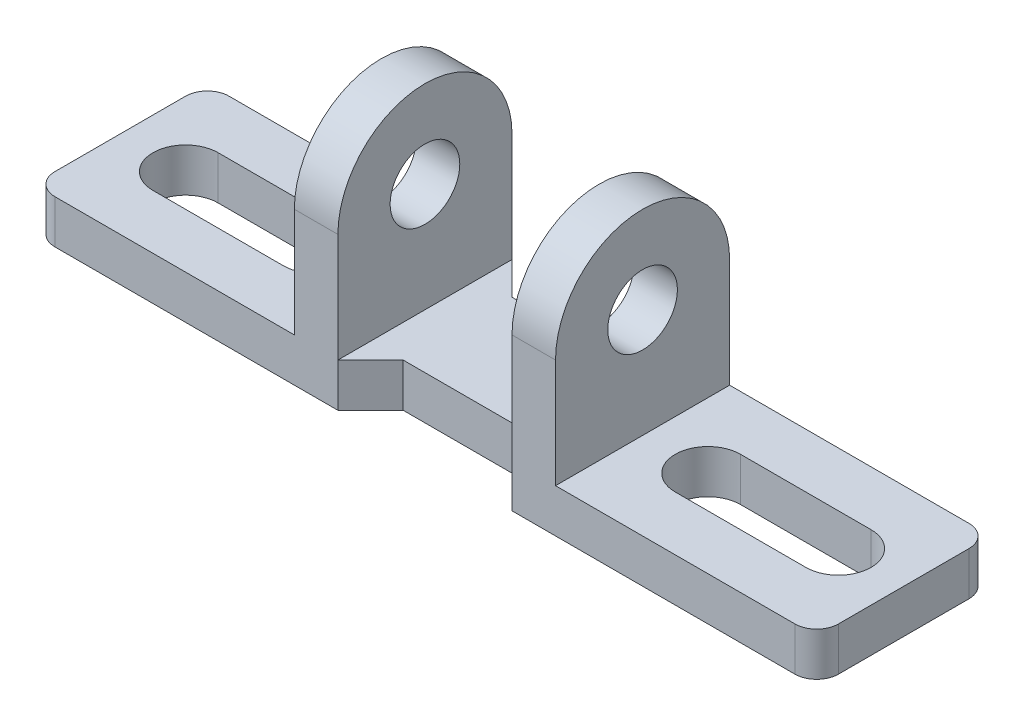
ISO-10303-21;
HEADER;
FILE_DESCRIPTION(('STEP AP214'),'2;1');
FILE_NAME('part.step','',(''),(''),'','','');
FILE_SCHEMA(('AUTOMOTIVE_DESIGN { 1 0 10303 214 1 1 1 1 }'));
ENDSEC;
DATA;
#1=APPLICATION_CONTEXT('core data for automotive mechanical design processes');
#2=APPLICATION_PROTOCOL_DEFINITION('international standard','automotive_design',2000,#1);
#3=PRODUCT_CONTEXT('',#1,'mechanical');
#4=PRODUCT('Part','Part','',(#3));
#5=PRODUCT_RELATED_PRODUCT_CATEGORY('part','',(#4));
#6=PRODUCT_DEFINITION_FORMATION('','',#4);
#7=PRODUCT_DEFINITION_CONTEXT('part definition',#1,'design');
#8=PRODUCT_DEFINITION('design','',#6,#7);
#9=PRODUCT_DEFINITION_SHAPE('','',#8);
#10=(LENGTH_UNIT() NAMED_UNIT(*) SI_UNIT(.MILLI.,.METRE.));
#11=(NAMED_UNIT(*) PLANE_ANGLE_UNIT() SI_UNIT($,.RADIAN.));
#12=(NAMED_UNIT(*) SI_UNIT($,.STERADIAN.) SOLID_ANGLE_UNIT());
#13=UNCERTAINTY_MEASURE_WITH_UNIT(LENGTH_MEASURE(1.E-05),#10,'distance_accuracy_value','');
#14=(GEOMETRIC_REPRESENTATION_CONTEXT(3) GLOBAL_UNCERTAINTY_ASSIGNED_CONTEXT((#13)) GLOBAL_UNIT_ASSIGNED_CONTEXT((#10,
#11,#12)) REPRESENTATION_CONTEXT('',''));
#15=CARTESIAN_POINT('',(0.,0.,0.));
#16=DIRECTION('',(0.,0.,1.));
#17=DIRECTION('',(1.,0.,0.));
#18=AXIS2_PLACEMENT_3D('',#15,#16,#17);
#19=CARTESIAN_POINT('',(-18.,2.,-4.));
#20=DIRECTION('',(0.,0.,1.));
#21=DIRECTION('',(1.,0.,0.));
#22=AXIS2_PLACEMENT_3D('',#19,#20,#21);
#23=PLANE('',#22);
#24=DIRECTION('',(-1.,0.,0.));
#25=VECTOR('',#24,1.);
#26=CARTESIAN_POINT('',(-18.,0.,-4.));
#27=LINE('',#26,#25);
#28=CARTESIAN_POINT('',(-4.,0.,-4.));
#29=VERTEX_POINT('',#28);
#30=CARTESIAN_POINT('',(-17.,0.,-4.));
#31=VERTEX_POINT('',#30);
#32=EDGE_CURVE('E384',#29,#31,#27,.T.);
#33=ORIENTED_EDGE('',*,*,#32,.T.);
#34=DIRECTION('',(0.,-1.,0.));
#35=VECTOR('',#34,1.);
#36=CARTESIAN_POINT('',(-17.,2.,-4.));
#37=LINE('',#36,#35);
#38=CARTESIAN_POINT('',(-17.,2.,-4.));
#39=VERTEX_POINT('',#38);
#40=EDGE_CURVE('E12',#31,#39,#37,.F.);
#41=ORIENTED_EDGE('',*,*,#40,.T.);
#42=DIRECTION('',(-1.,0.,0.));
#43=VECTOR('',#42,1.);
#44=CARTESIAN_POINT('',(-18.,2.,-4.));
#45=LINE('',#44,#43);
#46=CARTESIAN_POINT('',(-6.,2.,-4.));
#47=VERTEX_POINT('',#46);
#48=EDGE_CURVE('E372',#47,#39,#45,.T.);
#49=ORIENTED_EDGE('',*,*,#48,.F.);
#50=DIRECTION('',(0.,-1.,0.));
#51=VECTOR('',#50,1.);
#52=CARTESIAN_POINT('',(-6.,11.,-4.));
#53=LINE('',#52,#51);
#54=CARTESIAN_POINT('',(-6.,7.,-4.));
#55=VERTEX_POINT('',#54);
#56=EDGE_CURVE('E297',#55,#47,#53,.T.);
#57=ORIENTED_EDGE('',*,*,#56,.F.);
#58=DIRECTION('',(1.,0.,0.));
#59=VECTOR('',#58,1.);
#60=CARTESIAN_POINT('',(-18.,7.,-4.));
#61=LINE('',#60,#59);
#62=CARTESIAN_POINT('',(-4.,7.,-4.));
#63=VERTEX_POINT('',#62);
#64=EDGE_CURVE('E269',#55,#63,#61,.T.);
#65=ORIENTED_EDGE('',*,*,#64,.T.);
#66=DIRECTION('',(0.,-1.,0.));
#67=VECTOR('',#66,1.);
#68=CARTESIAN_POINT('',(-4.,11.,-4.));
#69=LINE('',#68,#67);
#70=CARTESIAN_POINT('',(-4.,2.,-4.));
#71=VERTEX_POINT('',#70);
#72=EDGE_CURVE('E299',#63,#71,#69,.T.);
#73=ORIENTED_EDGE('',*,*,#72,.T.);
#74=DIRECTION('',(0.,1.,0.));
#75=VECTOR('',#74,1.);
#76=CARTESIAN_POINT('',(-4.,0.,-4.));
#77=LINE('',#76,#75);
#78=EDGE_CURVE('E447',#29,#71,#77,.T.);
#79=ORIENTED_EDGE('',*,*,#78,.F.);
#80=EDGE_LOOP('',(#33,#41,#49,#57,#65,#73,#79));
#81=FACE_BOUND('',#80,.T.);
#82=ADVANCED_FACE('F60',(#81),#23,.F.);
#83=CARTESIAN_POINT('',(17.,2.,-4.));
#84=VERTEX_POINT('',#83);
#85=CARTESIAN_POINT('',(6.,2.,-4.));
#86=VERTEX_POINT('',#85);
#87=EDGE_CURVE('E374',#84,#86,#45,.T.);
#88=ORIENTED_EDGE('',*,*,#87,.F.);
#89=DIRECTION('',(0.,-1.,0.));
#90=VECTOR('',#89,1.);
#91=CARTESIAN_POINT('',(17.,2.,-4.));
#92=LINE('',#91,#90);
#93=CARTESIAN_POINT('',(17.,0.,-4.));
#94=VERTEX_POINT('',#93);
#95=EDGE_CURVE('E381',#84,#94,#92,.T.);
#96=ORIENTED_EDGE('',*,*,#95,.T.);
#97=CARTESIAN_POINT('',(4.,0.,-4.));
#98=VERTEX_POINT('',#97);
#99=EDGE_CURVE('E385',#94,#98,#27,.T.);
#100=ORIENTED_EDGE('',*,*,#99,.T.);
#101=DIRECTION('',(0.,1.,0.));
#102=VECTOR('',#101,1.);
#103=CARTESIAN_POINT('',(4.,0.,-4.));
#104=LINE('',#103,#102);
#105=CARTESIAN_POINT('',(4.,2.,-4.));
#106=VERTEX_POINT('',#105);
#107=EDGE_CURVE('E454',#98,#106,#104,.T.);
#108=ORIENTED_EDGE('',*,*,#107,.T.);
#109=DIRECTION('',(0.,-1.,0.));
#110=VECTOR('',#109,1.);
#111=CARTESIAN_POINT('',(4.,11.,-4.));
#112=LINE('',#111,#110);
#113=CARTESIAN_POINT('',(4.,7.,-4.));
#114=VERTEX_POINT('',#113);
#115=EDGE_CURVE('E278',#114,#106,#112,.T.);
#116=ORIENTED_EDGE('',*,*,#115,.F.);
#117=CARTESIAN_POINT('',(6.,7.,-4.));
#118=VERTEX_POINT('',#117);
#119=EDGE_CURVE('E262',#114,#118,#61,.T.);
#120=ORIENTED_EDGE('',*,*,#119,.T.);
#121=DIRECTION('',(0.,-1.,0.));
#122=VECTOR('',#121,1.);
#123=CARTESIAN_POINT('',(6.,11.,-4.));
#124=LINE('',#123,#122);
#125=EDGE_CURVE('E275',#118,#86,#124,.T.);
#126=ORIENTED_EDGE('',*,*,#125,.T.);
#127=EDGE_LOOP('',(#88,#96,#100,#108,#116,#120,#126));
#128=FACE_BOUND('',#127,.T.);
#129=ADVANCED_FACE('F274',(#128),#23,.F.);
#130=CARTESIAN_POINT('',(-6.,11.,4.));
#131=DIRECTION('',(1.,0.,0.));
#132=DIRECTION('',(0.,0.,-1.));
#133=AXIS2_PLACEMENT_3D('',#130,#131,#132);
#134=PLANE('',#133);
#135=CARTESIAN_POINT('',(-6.,7.,0.));
#136=DIRECTION('',(1.,0.,0.));
#137=DIRECTION('',(0.,0.,-1.));
#138=AXIS2_PLACEMENT_3D('',#135,#136,#137);
#139=CIRCLE('',#138,1.6);
#140=CARTESIAN_POINT('',(-6.,7.,-1.6));
#141=VERTEX_POINT('',#140);
#142=EDGE_CURVE('E500',#141,#141,#139,.T.);
#143=ORIENTED_EDGE('',*,*,#142,.T.);
#144=EDGE_LOOP('',(#143));
#145=FACE_BOUND('',#144,.T.);
#146=CARTESIAN_POINT('',(-6.,7.,0.));
#147=DIRECTION('',(1.,0.,0.));
#148=DIRECTION('',(0.,0.,-1.));
#149=AXIS2_PLACEMENT_3D('',#146,#147,#148);
#150=CIRCLE('',#149,4.00000000000001);
#151=CARTESIAN_POINT('',(-6.,7.,4.));
#152=VERTEX_POINT('',#151);
#153=EDGE_CURVE('E535',#152,#55,#150,.F.);
#154=ORIENTED_EDGE('',*,*,#153,.T.);
#155=ORIENTED_EDGE('',*,*,#56,.T.);
#156=DIRECTION('',(0.,0.,1.));
#157=VECTOR('',#156,1.);
#158=CARTESIAN_POINT('',(-6.,2.,4.));
#159=LINE('',#158,#157);
#160=CARTESIAN_POINT('',(-6.,2.,4.));
#161=VERTEX_POINT('',#160);
#162=EDGE_CURVE('E291',#47,#161,#159,.T.);
#163=ORIENTED_EDGE('',*,*,#162,.T.);
#164=DIRECTION('',(0.,-1.,0.));
#165=VECTOR('',#164,1.);
#166=CARTESIAN_POINT('',(-6.,11.,4.));
#167=LINE('',#166,#165);
#168=EDGE_CURVE('E303',#152,#161,#167,.T.);
#169=ORIENTED_EDGE('',*,*,#168,.F.);
#170=EDGE_LOOP('',(#154,#155,#163,#169));
#171=FACE_BOUND('',#170,.T.);
#172=ADVANCED_FACE('F601',(#145,#171),#134,.F.);
#173=CARTESIAN_POINT('',(-4.,11.,4.));
#174=DIRECTION('',(-1.,0.,0.));
#175=DIRECTION('',(0.,0.,1.));
#176=AXIS2_PLACEMENT_3D('',#173,#174,#175);
#177=PLANE('',#176);
#178=CARTESIAN_POINT('',(-4.,7.,0.));
#179=DIRECTION('',(-1.,0.,0.));
#180=DIRECTION('',(0.,0.,1.));
#181=AXIS2_PLACEMENT_3D('',#178,#179,#180);
#182=CIRCLE('',#181,1.6);
#183=CARTESIAN_POINT('',(-4.,7.,1.6));
#184=VERTEX_POINT('',#183);
#185=EDGE_CURVE('E529',#184,#184,#182,.T.);
#186=ORIENTED_EDGE('',*,*,#185,.T.);
#187=EDGE_LOOP('',(#186));
#188=FACE_BOUND('',#187,.T.);
#189=ORIENTED_EDGE('',*,*,#72,.F.);
#190=CARTESIAN_POINT('',(-4.,7.,0.));
#191=DIRECTION('',(-1.,0.,0.));
#192=DIRECTION('',(0.,0.,1.));
#193=AXIS2_PLACEMENT_3D('',#190,#191,#192);
#194=CIRCLE('',#193,4.00000000000001);
#195=CARTESIAN_POINT('',(-4.,7.,4.));
#196=VERTEX_POINT('',#195);
#197=EDGE_CURVE('E537',#63,#196,#194,.F.);
#198=ORIENTED_EDGE('',*,*,#197,.T.);
#199=DIRECTION('',(0.,-1.,0.));
#200=VECTOR('',#199,1.);
#201=CARTESIAN_POINT('',(-4.,11.,4.));
#202=LINE('',#201,#200);
#203=CARTESIAN_POINT('',(-4.,2.,4.));
#204=VERTEX_POINT('',#203);
#205=EDGE_CURVE('E301',#196,#204,#202,.T.);
#206=ORIENTED_EDGE('',*,*,#205,.T.);
#207=DIRECTION('',(0.,0.,-1.));
#208=VECTOR('',#207,1.);
#209=CARTESIAN_POINT('',(-4.,2.,4.));
#210=LINE('',#209,#208);
#211=EDGE_CURVE('E294',#204,#71,#210,.T.);
#212=ORIENTED_EDGE('',*,*,#211,.T.);
#213=EDGE_LOOP('',(#189,#198,#206,#212));
#214=FACE_BOUND('',#213,.T.);
#215=ADVANCED_FACE('F551',(#188,#214),#177,.F.);
#216=CARTESIAN_POINT('',(4.,11.,-4.));
#217=DIRECTION('',(1.,0.,0.));
#218=DIRECTION('',(0.,0.,-1.));
#219=AXIS2_PLACEMENT_3D('',#216,#217,#218);
#220=PLANE('',#219);
#221=CARTESIAN_POINT('',(4.,7.,0.));
#222=DIRECTION('',(1.,0.,0.));
#223=DIRECTION('',(0.,0.,-1.));
#224=AXIS2_PLACEMENT_3D('',#221,#222,#223);
#225=CIRCLE('',#224,1.6);
#226=CARTESIAN_POINT('',(4.,7.,-1.6));
#227=VERTEX_POINT('',#226);
#228=EDGE_CURVE('E532',#227,#227,#225,.T.);
#229=ORIENTED_EDGE('',*,*,#228,.T.);
#230=EDGE_LOOP('',(#229));
#231=FACE_BOUND('',#230,.T.);
#232=CARTESIAN_POINT('',(4.,7.,0.));
#233=DIRECTION('',(1.,0.,0.));
#234=DIRECTION('',(0.,0.,-1.));
#235=AXIS2_PLACEMENT_3D('',#232,#233,#234);
#236=CIRCLE('',#235,4.00000000000001);
#237=CARTESIAN_POINT('',(4.,7.,4.));
#238=VERTEX_POINT('',#237);
#239=EDGE_CURVE('E540',#238,#114,#236,.F.);
#240=ORIENTED_EDGE('',*,*,#239,.T.);
#241=ORIENTED_EDGE('',*,*,#115,.T.);
#242=DIRECTION('',(0.,0.,1.));
#243=VECTOR('',#242,1.);
#244=CARTESIAN_POINT('',(4.,2.,-4.));
#245=LINE('',#244,#243);
#246=CARTESIAN_POINT('',(4.,2.,4.));
#247=VERTEX_POINT('',#246);
#248=EDGE_CURVE('E464',#106,#247,#245,.T.);
#249=ORIENTED_EDGE('',*,*,#248,.T.);
#250=DIRECTION('',(0.,-1.,0.));
#251=VECTOR('',#250,1.);
#252=CARTESIAN_POINT('',(4.,11.,4.));
#253=LINE('',#252,#251);
#254=EDGE_CURVE('E285',#238,#247,#253,.T.);
#255=ORIENTED_EDGE('',*,*,#254,.F.);
#256=EDGE_LOOP('',(#240,#241,#249,#255));
#257=FACE_BOUND('',#256,.T.);
#258=ADVANCED_FACE('F623',(#231,#257),#220,.F.);
#259=CARTESIAN_POINT('',(6.,11.,-4.));
#260=DIRECTION('',(-1.,0.,0.));
#261=DIRECTION('',(0.,0.,1.));
#262=AXIS2_PLACEMENT_3D('',#259,#260,#261);
#263=PLANE('',#262);
#264=CARTESIAN_POINT('',(6.,7.,0.));
#265=DIRECTION('',(1.,0.,0.));
#266=DIRECTION('',(0.,0.,-1.));
#267=AXIS2_PLACEMENT_3D('',#264,#265,#266);
#268=CIRCLE('',#267,1.6);
#269=CARTESIAN_POINT('',(6.,7.,-1.6));
#270=VERTEX_POINT('',#269);
#271=EDGE_CURVE('E542',#270,#270,#268,.T.);
#272=ORIENTED_EDGE('',*,*,#271,.F.);
#273=EDGE_LOOP('',(#272));
#274=FACE_BOUND('',#273,.T.);
#275=ORIENTED_EDGE('',*,*,#125,.F.);
#276=CARTESIAN_POINT('',(6.,7.,0.));
#277=DIRECTION('',(1.,0.,0.));
#278=DIRECTION('',(0.,0.,-1.));
#279=AXIS2_PLACEMENT_3D('',#276,#277,#278);
#280=CIRCLE('',#279,4.00000000000001);
#281=CARTESIAN_POINT('',(6.,7.,4.));
#282=VERTEX_POINT('',#281);
#283=EDGE_CURVE('E259',#282,#118,#280,.F.);
#284=ORIENTED_EDGE('',*,*,#283,.F.);
#285=DIRECTION('',(0.,-1.,0.));
#286=VECTOR('',#285,1.);
#287=CARTESIAN_POINT('',(6.,11.,4.));
#288=LINE('',#287,#286);
#289=CARTESIAN_POINT('',(6.,2.,4.));
#290=VERTEX_POINT('',#289);
#291=EDGE_CURVE('E283',#282,#290,#288,.T.);
#292=ORIENTED_EDGE('',*,*,#291,.T.);
#293=DIRECTION('',(0.,0.,-1.));
#294=VECTOR('',#293,1.);
#295=CARTESIAN_POINT('',(6.,2.,-4.));
#296=LINE('',#295,#294);
#297=EDGE_CURVE('E282',#290,#86,#296,.T.);
#298=ORIENTED_EDGE('',*,*,#297,.T.);
#299=EDGE_LOOP('',(#275,#284,#292,#298));
#300=FACE_BOUND('',#299,.T.);
#301=ADVANCED_FACE('F280',(#274,#300),#263,.F.);
#302=CARTESIAN_POINT('',(0.,2.,0.));
#303=DIRECTION('',(0.,1.,0.));
#304=DIRECTION('',(0.,0.,1.));
#305=AXIS2_PLACEMENT_3D('',#302,#303,#304);
#306=PLANE('',#305);
#307=DIRECTION('',(1.,0.,0.));
#308=VECTOR('',#307,1.);
#309=CARTESIAN_POINT('',(0.,2.,2.5));
#310=LINE('',#309,#308);
#311=CARTESIAN_POINT('',(-2.49999999999998,2.,2.5));
#312=VERTEX_POINT('',#311);
#313=CARTESIAN_POINT('',(2.49999999999998,2.,2.5));
#314=VERTEX_POINT('',#313);
#315=EDGE_CURVE('E518',#312,#314,#310,.T.);
#316=ORIENTED_EDGE('',*,*,#315,.T.);
#317=DIRECTION('',(0.707106781186552,0.,0.707106781186543));
#318=VECTOR('',#317,1.);
#319=CARTESIAN_POINT('',(0.,2.,0.));
#320=LINE('',#319,#318);
#321=EDGE_CURVE('E456',#314,#247,#320,.T.);
#322=ORIENTED_EDGE('',*,*,#321,.T.);
#323=ORIENTED_EDGE('',*,*,#248,.F.);
#324=DIRECTION('',(0.707106781186551,0.,-0.707106781186544));
#325=VECTOR('',#324,1.);
#326=CARTESIAN_POINT('',(0.,2.,0.));
#327=LINE('',#326,#325);
#328=CARTESIAN_POINT('',(2.49999999999998,2.,-2.5));
#329=VERTEX_POINT('',#328);
#330=EDGE_CURVE('E499',#329,#106,#327,.T.);
#331=ORIENTED_EDGE('',*,*,#330,.F.);
#332=DIRECTION('',(1.,0.,0.));
#333=VECTOR('',#332,1.);
#334=CARTESIAN_POINT('',(0.,2.,-2.5));
#335=LINE('',#334,#333);
#336=CARTESIAN_POINT('',(-2.49999999999998,2.,-2.5));
#337=VERTEX_POINT('',#336);
#338=EDGE_CURVE('E496',#337,#329,#335,.T.);
#339=ORIENTED_EDGE('',*,*,#338,.F.);
#340=DIRECTION('',(0.707106781186551,0.,0.707106781186544));
#341=VECTOR('',#340,1.);
#342=CARTESIAN_POINT('',(0.,2.,0.));
#343=LINE('',#342,#341);
#344=EDGE_CURVE('E492',#71,#337,#343,.T.);
#345=ORIENTED_EDGE('',*,*,#344,.F.);
#346=ORIENTED_EDGE('',*,*,#211,.F.);
#347=DIRECTION('',(0.707106781186554,0.,-0.707106781186542));
#348=VECTOR('',#347,1.);
#349=CARTESIAN_POINT('',(0.,2.,0.));
#350=LINE('',#349,#348);
#351=EDGE_CURVE('E481',#204,#312,#350,.T.);
#352=ORIENTED_EDGE('',*,*,#351,.T.);
#353=EDGE_LOOP('',(#316,#322,#323,#331,#339,#345,#346,#352));
#354=FACE_BOUND('',#353,.T.);
#355=ADVANCED_FACE('F509',(#354),#306,.T.);
#356=CARTESIAN_POINT('',(0.,0.,0.));
#357=DIRECTION('',(0.,1.,0.));
#358=DIRECTION('',(0.,0.,1.));
#359=AXIS2_PLACEMENT_3D('',#356,#357,#358);
#360=PLANE('',#359);
#361=CARTESIAN_POINT('',(9.,0.,0.));
#362=DIRECTION('',(0.,1.,0.));
#363=DIRECTION('',(0.,0.,1.));
#364=AXIS2_PLACEMENT_3D('',#361,#362,#363);
#365=CIRCLE('',#364,1.5);
#366=CARTESIAN_POINT('',(9.,0.,-1.5));
#367=VERTEX_POINT('',#366);
#368=CARTESIAN_POINT('',(9.,0.,1.5));
#369=VERTEX_POINT('',#368);
#370=EDGE_CURVE('E306',#367,#369,#365,.T.);
#371=ORIENTED_EDGE('',*,*,#370,.T.);
#372=DIRECTION('',(1.,0.,0.));
#373=VECTOR('',#372,1.);
#374=CARTESIAN_POINT('',(9.,0.,1.5));
#375=LINE('',#374,#373);
#376=CARTESIAN_POINT('',(15.,0.,1.5));
#377=VERTEX_POINT('',#376);
#378=EDGE_CURVE('E320',#369,#377,#375,.T.);
#379=ORIENTED_EDGE('',*,*,#378,.T.);
#380=CARTESIAN_POINT('',(15.,0.,0.));
#381=DIRECTION('',(0.,1.,0.));
#382=DIRECTION('',(0.,0.,1.));
#383=AXIS2_PLACEMENT_3D('',#380,#381,#382);
#384=CIRCLE('',#383,1.5);
#385=CARTESIAN_POINT('',(15.,0.,-1.5));
#386=VERTEX_POINT('',#385);
#387=EDGE_CURVE('E323',#377,#386,#384,.T.);
#388=ORIENTED_EDGE('',*,*,#387,.T.);
#389=DIRECTION('',(-1.,0.,0.));
#390=VECTOR('',#389,1.);
#391=CARTESIAN_POINT('',(9.,0.,-1.5));
#392=LINE('',#391,#390);
#393=EDGE_CURVE('E310',#386,#367,#392,.T.);
#394=ORIENTED_EDGE('',*,*,#393,.T.);
#395=EDGE_LOOP('',(#371,#379,#388,#394));
#396=FACE_BOUND('',#395,.T.);
#397=CARTESIAN_POINT('',(-15.,0.,0.));
#398=DIRECTION('',(0.,1.,0.));
#399=DIRECTION('',(0.,0.,1.));
#400=AXIS2_PLACEMENT_3D('',#397,#398,#399);
#401=CIRCLE('',#400,1.5);
#402=CARTESIAN_POINT('',(-15.,0.,-1.5));
#403=VERTEX_POINT('',#402);
#404=CARTESIAN_POINT('',(-15.,0.,1.5));
#405=VERTEX_POINT('',#404);
#406=EDGE_CURVE('E337',#403,#405,#401,.T.);
#407=ORIENTED_EDGE('',*,*,#406,.T.);
#408=DIRECTION('',(1.,0.,0.));
#409=VECTOR('',#408,1.);
#410=CARTESIAN_POINT('',(-15.,0.,1.5));
#411=LINE('',#410,#409);
#412=CARTESIAN_POINT('',(-9.,0.,1.5));
#413=VERTEX_POINT('',#412);
#414=EDGE_CURVE('E351',#405,#413,#411,.T.);
#415=ORIENTED_EDGE('',*,*,#414,.T.);
#416=CARTESIAN_POINT('',(-9.,0.,0.));
#417=DIRECTION('',(0.,1.,0.));
#418=DIRECTION('',(0.,0.,1.));
#419=AXIS2_PLACEMENT_3D('',#416,#417,#418);
#420=CIRCLE('',#419,1.5);
#421=CARTESIAN_POINT('',(-9.,0.,-1.5));
#422=VERTEX_POINT('',#421);
#423=EDGE_CURVE('E354',#413,#422,#420,.T.);
#424=ORIENTED_EDGE('',*,*,#423,.T.);
#425=DIRECTION('',(-1.,0.,0.));
#426=VECTOR('',#425,1.);
#427=CARTESIAN_POINT('',(-15.,0.,-1.5));
#428=LINE('',#427,#426);
#429=EDGE_CURVE('E341',#422,#403,#428,.T.);
#430=ORIENTED_EDGE('',*,*,#429,.T.);
#431=EDGE_LOOP('',(#407,#415,#424,#430));
#432=FACE_BOUND('',#431,.T.);
#433=ORIENTED_EDGE('',*,*,#99,.F.);
#434=CARTESIAN_POINT('',(17.,0.,-3.));
#435=DIRECTION('',(0.,1.,0.));
#436=DIRECTION('',(0.,0.,1.));
#437=AXIS2_PLACEMENT_3D('',#434,#435,#436);
#438=CIRCLE('',#437,1.);
#439=CARTESIAN_POINT('',(18.,0.,-3.));
#440=VERTEX_POINT('',#439);
#441=EDGE_CURVE('E399',#94,#440,#438,.F.);
#442=ORIENTED_EDGE('',*,*,#441,.T.);
#443=DIRECTION('',(0.,0.,-1.));
#444=VECTOR('',#443,1.);
#445=CARTESIAN_POINT('',(18.,0.,-4.));
#446=LINE('',#445,#444);
#447=CARTESIAN_POINT('',(18.,0.,3.));
#448=VERTEX_POINT('',#447);
#449=EDGE_CURVE('E368',#448,#440,#446,.T.);
#450=ORIENTED_EDGE('',*,*,#449,.F.);
#451=CARTESIAN_POINT('',(17.,0.,3.));
#452=DIRECTION('',(0.,1.,0.));
#453=DIRECTION('',(0.,0.,1.));
#454=AXIS2_PLACEMENT_3D('',#451,#452,#453);
#455=CIRCLE('',#454,1.);
#456=CARTESIAN_POINT('',(17.,0.,4.));
#457=VERTEX_POINT('',#456);
#458=EDGE_CURVE('E397',#448,#457,#455,.F.);
#459=ORIENTED_EDGE('',*,*,#458,.T.);
#460=DIRECTION('',(1.,0.,0.));
#461=VECTOR('',#460,1.);
#462=CARTESIAN_POINT('',(-18.,0.,4.));
#463=LINE('',#462,#461);
#464=CARTESIAN_POINT('',(4.,0.,4.));
#465=VERTEX_POINT('',#464);
#466=EDGE_CURVE('E389',#465,#457,#463,.T.);
#467=ORIENTED_EDGE('',*,*,#466,.F.);
#468=DIRECTION('',(0.707106781186552,0.,0.707106781186543));
#469=VECTOR('',#468,1.);
#470=CARTESIAN_POINT('',(0.,0.,0.));
#471=LINE('',#470,#469);
#472=CARTESIAN_POINT('',(2.49999999999998,0.,2.5));
#473=VERTEX_POINT('',#472);
#474=EDGE_CURVE('E525',#473,#465,#471,.T.);
#475=ORIENTED_EDGE('',*,*,#474,.F.);
#476=DIRECTION('',(1.,0.,0.));
#477=VECTOR('',#476,1.);
#478=CARTESIAN_POINT('',(0.,0.,2.5));
#479=LINE('',#478,#477);
#480=CARTESIAN_POINT('',(-2.49999999999998,0.,2.5));
#481=VERTEX_POINT('',#480);
#482=EDGE_CURVE('E523',#481,#473,#479,.T.);
#483=ORIENTED_EDGE('',*,*,#482,.F.);
#484=DIRECTION('',(0.707106781186554,0.,-0.707106781186542));
#485=VECTOR('',#484,1.);
#486=CARTESIAN_POINT('',(0.,0.,0.));
#487=LINE('',#486,#485);
#488=CARTESIAN_POINT('',(-4.,0.,4.));
#489=VERTEX_POINT('',#488);
#490=EDGE_CURVE('E487',#489,#481,#487,.T.);
#491=ORIENTED_EDGE('',*,*,#490,.F.);
#492=CARTESIAN_POINT('',(-17.,0.,4.));
#493=VERTEX_POINT('',#492);
#494=EDGE_CURVE('E373',#493,#489,#463,.T.);
#495=ORIENTED_EDGE('',*,*,#494,.F.);
#496=CARTESIAN_POINT('',(-17.,0.,3.));
#497=DIRECTION('',(0.,1.,0.));
#498=DIRECTION('',(0.,0.,1.));
#499=AXIS2_PLACEMENT_3D('',#496,#497,#498);
#500=CIRCLE('',#499,1.);
#501=CARTESIAN_POINT('',(-18.,0.,3.));
#502=VERTEX_POINT('',#501);
#503=EDGE_CURVE('E395',#493,#502,#500,.F.);
#504=ORIENTED_EDGE('',*,*,#503,.T.);
#505=DIRECTION('',(0.,0.,1.));
#506=VECTOR('',#505,1.);
#507=CARTESIAN_POINT('',(-18.,0.,-4.));
#508=LINE('',#507,#506);
#509=CARTESIAN_POINT('',(-18.,0.,-3.));
#510=VERTEX_POINT('',#509);
#511=EDGE_CURVE('E387',#510,#502,#508,.T.);
#512=ORIENTED_EDGE('',*,*,#511,.F.);
#513=CARTESIAN_POINT('',(-17.,0.,-3.));
#514=DIRECTION('',(0.,1.,0.));
#515=DIRECTION('',(0.,0.,1.));
#516=AXIS2_PLACEMENT_3D('',#513,#514,#515);
#517=CIRCLE('',#516,1.);
#518=EDGE_CURVE('E393',#510,#31,#517,.F.);
#519=ORIENTED_EDGE('',*,*,#518,.T.);
#520=ORIENTED_EDGE('',*,*,#32,.F.);
#521=DIRECTION('',(0.707106781186551,0.,0.707106781186544));
#522=VECTOR('',#521,1.);
#523=CARTESIAN_POINT('',(0.,0.,0.));
#524=LINE('',#523,#522);
#525=CARTESIAN_POINT('',(-2.49999999999998,0.,-2.5));
#526=VERTEX_POINT('',#525);
#527=EDGE_CURVE('E463',#29,#526,#524,.T.);
#528=ORIENTED_EDGE('',*,*,#527,.T.);
#529=DIRECTION('',(1.,0.,0.));
#530=VECTOR('',#529,1.);
#531=CARTESIAN_POINT('',(0.,0.,-2.5));
#532=LINE('',#531,#530);
#533=CARTESIAN_POINT('',(2.49999999999998,0.,-2.5));
#534=VERTEX_POINT('',#533);
#535=EDGE_CURVE('E488',#526,#534,#532,.T.);
#536=ORIENTED_EDGE('',*,*,#535,.T.);
#537=DIRECTION('',(0.707106781186551,0.,-0.707106781186544));
#538=VECTOR('',#537,1.);
#539=CARTESIAN_POINT('',(0.,0.,0.));
#540=LINE('',#539,#538);
#541=EDGE_CURVE('E491',#534,#98,#540,.T.);
#542=ORIENTED_EDGE('',*,*,#541,.T.);
#543=EDGE_LOOP('',(#433,#442,#450,#459,#467,#475,#483,#491,#495,#504,#512,#519,#520,#528,#536,#542));
#544=FACE_BOUND('',#543,.T.);
#545=ADVANCED_FACE('F437',(#396,#432,#544),#360,.F.);
#546=CARTESIAN_POINT('',(-18.,2.,4.));
#547=DIRECTION('',(0.,0.,-1.));
#548=DIRECTION('',(-1.,0.,0.));
#549=AXIS2_PLACEMENT_3D('',#546,#547,#548);
#550=PLANE('',#549);
#551=ORIENTED_EDGE('',*,*,#466,.T.);
#552=DIRECTION('',(0.,-1.,0.));
#553=VECTOR('',#552,1.);
#554=CARTESIAN_POINT('',(17.,2.,4.));
#555=LINE('',#554,#553);
#556=CARTESIAN_POINT('',(17.,2.,4.));
#557=VERTEX_POINT('',#556);
#558=EDGE_CURVE('E410',#457,#557,#555,.F.);
#559=ORIENTED_EDGE('',*,*,#558,.T.);
#560=DIRECTION('',(1.,0.,0.));
#561=VECTOR('',#560,1.);
#562=CARTESIAN_POINT('',(-18.,2.,4.));
#563=LINE('',#562,#561);
#564=EDGE_CURVE('E378',#290,#557,#563,.T.);
#565=ORIENTED_EDGE('',*,*,#564,.F.);
#566=ORIENTED_EDGE('',*,*,#291,.F.);
#567=DIRECTION('',(1.,0.,0.));
#568=VECTOR('',#567,1.);
#569=CARTESIAN_POINT('',(-18.,7.,4.));
#570=LINE('',#569,#568);
#571=EDGE_CURVE('E265',#238,#282,#570,.T.);
#572=ORIENTED_EDGE('',*,*,#571,.F.);
#573=ORIENTED_EDGE('',*,*,#254,.T.);
#574=DIRECTION('',(0.,1.,0.));
#575=VECTOR('',#574,1.);
#576=CARTESIAN_POINT('',(4.,0.,4.));
#577=LINE('',#576,#575);
#578=EDGE_CURVE('E466',#465,#247,#577,.T.);
#579=ORIENTED_EDGE('',*,*,#578,.F.);
#580=EDGE_LOOP('',(#551,#559,#565,#566,#572,#573,#579));
#581=FACE_BOUND('',#580,.T.);
#582=ADVANCED_FACE('F567',(#581),#550,.F.);
#583=CARTESIAN_POINT('',(-17.,2.,4.));
#584=VERTEX_POINT('',#583);
#585=EDGE_CURVE('E379',#584,#161,#563,.T.);
#586=ORIENTED_EDGE('',*,*,#585,.F.);
#587=DIRECTION('',(0.,-1.,0.));
#588=VECTOR('',#587,1.);
#589=CARTESIAN_POINT('',(-17.,2.,4.));
#590=LINE('',#589,#588);
#591=EDGE_CURVE('E412',#584,#493,#590,.T.);
#592=ORIENTED_EDGE('',*,*,#591,.T.);
#593=ORIENTED_EDGE('',*,*,#494,.T.);
#594=DIRECTION('',(0.,1.,0.));
#595=VECTOR('',#594,1.);
#596=CARTESIAN_POINT('',(-4.,0.,4.));
#597=LINE('',#596,#595);
#598=EDGE_CURVE('E471',#489,#204,#597,.T.);
#599=ORIENTED_EDGE('',*,*,#598,.T.);
#600=ORIENTED_EDGE('',*,*,#205,.F.);
#601=EDGE_CURVE('E545',#152,#196,#570,.T.);
#602=ORIENTED_EDGE('',*,*,#601,.F.);
#603=ORIENTED_EDGE('',*,*,#168,.T.);
#604=EDGE_LOOP('',(#586,#592,#593,#599,#600,#602,#603));
#605=FACE_BOUND('',#604,.T.);
#606=ADVANCED_FACE('F429',(#605),#550,.F.);
#607=DIRECTION('',(1.,0.,0.));
#608=VECTOR('',#607,1.);
#609=CARTESIAN_POINT('',(9.,2.,1.5));
#610=LINE('',#609,#608);
#611=CARTESIAN_POINT('',(9.,2.,1.5));
#612=VERTEX_POINT('',#611);
#613=CARTESIAN_POINT('',(15.,2.,1.5));
#614=VERTEX_POINT('',#613);
#615=EDGE_CURVE('E309',#612,#614,#610,.T.);
#616=ORIENTED_EDGE('',*,*,#615,.F.);
#617=CARTESIAN_POINT('',(9.,2.,0.));
#618=DIRECTION('',(0.,1.,0.));
#619=DIRECTION('',(0.,0.,1.));
#620=AXIS2_PLACEMENT_3D('',#617,#618,#619);
#621=CIRCLE('',#620,1.5);
#622=CARTESIAN_POINT('',(9.,2.,-1.5));
#623=VERTEX_POINT('',#622);
#624=EDGE_CURVE('E307',#623,#612,#621,.T.);
#625=ORIENTED_EDGE('',*,*,#624,.F.);
#626=DIRECTION('',(-1.,0.,0.));
#627=VECTOR('',#626,1.);
#628=CARTESIAN_POINT('',(9.,2.,-1.5));
#629=LINE('',#628,#627);
#630=CARTESIAN_POINT('',(15.,2.,-1.5));
#631=VERTEX_POINT('',#630);
#632=EDGE_CURVE('E315',#631,#623,#629,.T.);
#633=ORIENTED_EDGE('',*,*,#632,.F.);
#634=CARTESIAN_POINT('',(15.,2.,0.));
#635=DIRECTION('',(0.,1.,0.));
#636=DIRECTION('',(0.,0.,1.));
#637=AXIS2_PLACEMENT_3D('',#634,#635,#636);
#638=CIRCLE('',#637,1.5);
#639=EDGE_CURVE('E312',#614,#631,#638,.T.);
#640=ORIENTED_EDGE('',*,*,#639,.F.);
#641=EDGE_LOOP('',(#616,#625,#633,#640));
#642=FACE_BOUND('',#641,.T.);
#643=DIRECTION('',(0.,0.,-1.));
#644=VECTOR('',#643,1.);
#645=CARTESIAN_POINT('',(18.,2.,-4.));
#646=LINE('',#645,#644);
#647=CARTESIAN_POINT('',(18.,2.,3.));
#648=VERTEX_POINT('',#647);
#649=CARTESIAN_POINT('',(18.,2.,-3.));
#650=VERTEX_POINT('',#649);
#651=EDGE_CURVE('E369',#648,#650,#646,.T.);
#652=ORIENTED_EDGE('',*,*,#651,.T.);
#653=CARTESIAN_POINT('',(17.,2.,-3.));
#654=DIRECTION('',(0.,1.,0.));
#655=DIRECTION('',(0.,0.,1.));
#656=AXIS2_PLACEMENT_3D('',#653,#654,#655);
#657=CIRCLE('',#656,1.);
#658=EDGE_CURVE('E408',#650,#84,#657,.T.);
#659=ORIENTED_EDGE('',*,*,#658,.T.);
#660=ORIENTED_EDGE('',*,*,#87,.T.);
#661=ORIENTED_EDGE('',*,*,#297,.F.);
#662=ORIENTED_EDGE('',*,*,#564,.T.);
#663=CARTESIAN_POINT('',(17.,2.,3.));
#664=DIRECTION('',(0.,1.,0.));
#665=DIRECTION('',(0.,0.,1.));
#666=AXIS2_PLACEMENT_3D('',#663,#664,#665);
#667=CIRCLE('',#666,1.);
#668=EDGE_CURVE('E406',#557,#648,#667,.T.);
#669=ORIENTED_EDGE('',*,*,#668,.T.);
#670=EDGE_LOOP('',(#652,#659,#660,#661,#662,#669));
#671=FACE_BOUND('',#670,.T.);
#672=ADVANCED_FACE('F576',(#642,#671),#306,.T.);
#673=DIRECTION('',(0.,0.,1.));
#674=VECTOR('',#673,1.);
#675=CARTESIAN_POINT('',(-18.,2.,-4.));
#676=LINE('',#675,#674);
#677=CARTESIAN_POINT('',(-18.,2.,-3.));
#678=VERTEX_POINT('',#677);
#679=CARTESIAN_POINT('',(-18.,2.,3.));
#680=VERTEX_POINT('',#679);
#681=EDGE_CURVE('E376',#678,#680,#676,.T.);
#682=ORIENTED_EDGE('',*,*,#681,.T.);
#683=CARTESIAN_POINT('',(-17.,2.,3.));
#684=DIRECTION('',(0.,1.,0.));
#685=DIRECTION('',(0.,0.,1.));
#686=AXIS2_PLACEMENT_3D('',#683,#684,#685);
#687=CIRCLE('',#686,1.);
#688=EDGE_CURVE('E68',#680,#584,#687,.T.);
#689=ORIENTED_EDGE('',*,*,#688,.T.);
#690=ORIENTED_EDGE('',*,*,#585,.T.);
#691=ORIENTED_EDGE('',*,*,#162,.F.);
#692=ORIENTED_EDGE('',*,*,#48,.T.);
#693=CARTESIAN_POINT('',(-17.,2.,-3.));
#694=DIRECTION('',(0.,1.,0.));
#695=DIRECTION('',(0.,0.,1.));
#696=AXIS2_PLACEMENT_3D('',#693,#694,#695);
#697=CIRCLE('',#696,1.);
#698=EDGE_CURVE('E419',#39,#678,#697,.T.);
#699=ORIENTED_EDGE('',*,*,#698,.T.);
#700=EDGE_LOOP('',(#682,#689,#690,#691,#692,#699));
#701=FACE_BOUND('',#700,.T.);
#702=DIRECTION('',(1.,0.,0.));
#703=VECTOR('',#702,1.);
#704=CARTESIAN_POINT('',(-15.,2.,1.5));
#705=LINE('',#704,#703);
#706=CARTESIAN_POINT('',(-15.,2.,1.5));
#707=VERTEX_POINT('',#706);
#708=CARTESIAN_POINT('',(-9.,2.,1.5));
#709=VERTEX_POINT('',#708);
#710=EDGE_CURVE('E340',#707,#709,#705,.T.);
#711=ORIENTED_EDGE('',*,*,#710,.F.);
#712=CARTESIAN_POINT('',(-15.,2.,0.));
#713=DIRECTION('',(0.,1.,0.));
#714=DIRECTION('',(0.,0.,1.));
#715=AXIS2_PLACEMENT_3D('',#712,#713,#714);
#716=CIRCLE('',#715,1.5);
#717=CARTESIAN_POINT('',(-15.,2.,-1.5));
#718=VERTEX_POINT('',#717);
#719=EDGE_CURVE('E338',#718,#707,#716,.T.);
#720=ORIENTED_EDGE('',*,*,#719,.F.);
#721=DIRECTION('',(-1.,0.,0.));
#722=VECTOR('',#721,1.);
#723=CARTESIAN_POINT('',(-15.,2.,-1.5));
#724=LINE('',#723,#722);
#725=CARTESIAN_POINT('',(-9.,2.,-1.5));
#726=VERTEX_POINT('',#725);
#727=EDGE_CURVE('E346',#726,#718,#724,.T.);
#728=ORIENTED_EDGE('',*,*,#727,.F.);
#729=CARTESIAN_POINT('',(-9.,2.,0.));
#730=DIRECTION('',(0.,1.,0.));
#731=DIRECTION('',(0.,0.,1.));
#732=AXIS2_PLACEMENT_3D('',#729,#730,#731);
#733=CIRCLE('',#732,1.5);
#734=EDGE_CURVE('E343',#709,#726,#733,.T.);
#735=ORIENTED_EDGE('',*,*,#734,.F.);
#736=EDGE_LOOP('',(#711,#720,#728,#735));
#737=FACE_BOUND('',#736,.T.);
#738=ADVANCED_FACE('F423',(#701,#737),#306,.T.);
#739=CARTESIAN_POINT('',(18.,2.,-4.));
#740=DIRECTION('',(-1.,0.,0.));
#741=DIRECTION('',(0.,0.,1.));
#742=AXIS2_PLACEMENT_3D('',#739,#740,#741);
#743=PLANE('',#742);
#744=ORIENTED_EDGE('',*,*,#449,.T.);
#745=DIRECTION('',(0.,-1.,0.));
#746=VECTOR('',#745,1.);
#747=CARTESIAN_POINT('',(18.,2.,-3.));
#748=LINE('',#747,#746);
#749=EDGE_CURVE('E404',#440,#650,#748,.F.);
#750=ORIENTED_EDGE('',*,*,#749,.T.);
#751=ORIENTED_EDGE('',*,*,#651,.F.);
#752=DIRECTION('',(0.,-1.,0.));
#753=VECTOR('',#752,1.);
#754=CARTESIAN_POINT('',(18.,2.,3.));
#755=LINE('',#754,#753);
#756=EDGE_CURVE('E401',#648,#448,#755,.T.);
#757=ORIENTED_EDGE('',*,*,#756,.T.);
#758=EDGE_LOOP('',(#744,#750,#751,#757));
#759=FACE_BOUND('',#758,.T.);
#760=ADVANCED_FACE('F579',(#759),#743,.F.);
#761=CARTESIAN_POINT('',(-18.,2.,-4.));
#762=DIRECTION('',(1.,0.,0.));
#763=DIRECTION('',(0.,0.,-1.));
#764=AXIS2_PLACEMENT_3D('',#761,#762,#763);
#765=PLANE('',#764);
#766=ORIENTED_EDGE('',*,*,#511,.T.);
#767=DIRECTION('',(0.,-1.,0.));
#768=VECTOR('',#767,1.);
#769=CARTESIAN_POINT('',(-18.,2.,3.));
#770=LINE('',#769,#768);
#771=EDGE_CURVE('E81',#502,#680,#770,.F.);
#772=ORIENTED_EDGE('',*,*,#771,.T.);
#773=ORIENTED_EDGE('',*,*,#681,.F.);
#774=DIRECTION('',(0.,-1.,0.));
#775=VECTOR('',#774,1.);
#776=CARTESIAN_POINT('',(-18.,2.,-3.));
#777=LINE('',#776,#775);
#778=EDGE_CURVE('E415',#678,#510,#777,.T.);
#779=ORIENTED_EDGE('',*,*,#778,.T.);
#780=EDGE_LOOP('',(#766,#772,#773,#779));
#781=FACE_BOUND('',#780,.T.);
#782=ADVANCED_FACE('F439',(#781),#765,.F.);
#783=CARTESIAN_POINT('',(-15.,2.,0.));
#784=DIRECTION('',(0.,-1.,0.));
#785=DIRECTION('',(0.,0.,-1.));
#786=AXIS2_PLACEMENT_3D('',#783,#784,#785);
#787=CYLINDRICAL_SURFACE('',#786,1.5);
#788=ORIENTED_EDGE('',*,*,#406,.F.);
#789=DIRECTION('',(0.,-1.,0.));
#790=VECTOR('',#789,1.);
#791=CARTESIAN_POINT('',(-15.,2.,-1.5));
#792=LINE('',#791,#790);
#793=EDGE_CURVE('E348',#718,#403,#792,.T.);
#794=ORIENTED_EDGE('',*,*,#793,.F.);
#795=ORIENTED_EDGE('',*,*,#719,.T.);
#796=DIRECTION('',(0.,-1.,0.));
#797=VECTOR('',#796,1.);
#798=CARTESIAN_POINT('',(-15.,2.,1.5));
#799=LINE('',#798,#797);
#800=EDGE_CURVE('E365',#707,#405,#799,.T.);
#801=ORIENTED_EDGE('',*,*,#800,.T.);
#802=EDGE_LOOP('',(#788,#794,#795,#801));
#803=FACE_BOUND('',#802,.T.);
#804=ADVANCED_FACE('F609',(#803),#787,.F.);
#805=CARTESIAN_POINT('',(-15.,2.,1.5));
#806=DIRECTION('',(0.,0.,-1.));
#807=DIRECTION('',(-1.,0.,0.));
#808=AXIS2_PLACEMENT_3D('',#805,#806,#807);
#809=PLANE('',#808);
#810=ORIENTED_EDGE('',*,*,#414,.F.);
#811=ORIENTED_EDGE('',*,*,#800,.F.);
#812=ORIENTED_EDGE('',*,*,#710,.T.);
#813=DIRECTION('',(0.,-1.,0.));
#814=VECTOR('',#813,1.);
#815=CARTESIAN_POINT('',(-9.,2.,1.5));
#816=LINE('',#815,#814);
#817=EDGE_CURVE('E363',#709,#413,#816,.T.);
#818=ORIENTED_EDGE('',*,*,#817,.T.);
#819=EDGE_LOOP('',(#810,#811,#812,#818));
#820=FACE_BOUND('',#819,.T.);
#821=ADVANCED_FACE('F664',(#820),#809,.T.);
#822=CARTESIAN_POINT('',(-9.,2.,0.));
#823=DIRECTION('',(0.,-1.,0.));
#824=DIRECTION('',(0.,0.,-1.));
#825=AXIS2_PLACEMENT_3D('',#822,#823,#824);
#826=CYLINDRICAL_SURFACE('',#825,1.5);
#827=ORIENTED_EDGE('',*,*,#423,.F.);
#828=ORIENTED_EDGE('',*,*,#817,.F.);
#829=ORIENTED_EDGE('',*,*,#734,.T.);
#830=DIRECTION('',(0.,-1.,0.));
#831=VECTOR('',#830,1.);
#832=CARTESIAN_POINT('',(-9.,2.,-1.5));
#833=LINE('',#832,#831);
#834=EDGE_CURVE('E361',#726,#422,#833,.T.);
#835=ORIENTED_EDGE('',*,*,#834,.T.);
#836=EDGE_LOOP('',(#827,#828,#829,#835));
#837=FACE_BOUND('',#836,.T.);
#838=ADVANCED_FACE('F660',(#837),#826,.F.);
#839=CARTESIAN_POINT('',(-15.,2.,-1.5));
#840=DIRECTION('',(0.,0.,1.));
#841=DIRECTION('',(1.,0.,0.));
#842=AXIS2_PLACEMENT_3D('',#839,#840,#841);
#843=PLANE('',#842);
#844=ORIENTED_EDGE('',*,*,#429,.F.);
#845=ORIENTED_EDGE('',*,*,#834,.F.);
#846=ORIENTED_EDGE('',*,*,#727,.T.);
#847=ORIENTED_EDGE('',*,*,#793,.T.);
#848=EDGE_LOOP('',(#844,#845,#846,#847));
#849=FACE_BOUND('',#848,.T.);
#850=ADVANCED_FACE('F656',(#849),#843,.T.);
#851=CARTESIAN_POINT('',(9.,2.,0.));
#852=DIRECTION('',(0.,-1.,0.));
#853=DIRECTION('',(0.,0.,-1.));
#854=AXIS2_PLACEMENT_3D('',#851,#852,#853);
#855=CYLINDRICAL_SURFACE('',#854,1.5);
#856=ORIENTED_EDGE('',*,*,#370,.F.);
#857=DIRECTION('',(0.,-1.,0.));
#858=VECTOR('',#857,1.);
#859=CARTESIAN_POINT('',(9.,2.,-1.5));
#860=LINE('',#859,#858);
#861=EDGE_CURVE('E317',#623,#367,#860,.T.);
#862=ORIENTED_EDGE('',*,*,#861,.F.);
#863=ORIENTED_EDGE('',*,*,#624,.T.);
#864=DIRECTION('',(0.,-1.,0.));
#865=VECTOR('',#864,1.);
#866=CARTESIAN_POINT('',(9.,2.,1.5));
#867=LINE('',#866,#865);
#868=EDGE_CURVE('E334',#612,#369,#867,.T.);
#869=ORIENTED_EDGE('',*,*,#868,.T.);
#870=EDGE_LOOP('',(#856,#862,#863,#869));
#871=FACE_BOUND('',#870,.T.);
#872=ADVANCED_FACE('F652',(#871),#855,.F.);
#873=CARTESIAN_POINT('',(9.,2.,1.5));
#874=DIRECTION('',(0.,0.,-1.));
#875=DIRECTION('',(-1.,0.,0.));
#876=AXIS2_PLACEMENT_3D('',#873,#874,#875);
#877=PLANE('',#876);
#878=ORIENTED_EDGE('',*,*,#378,.F.);
#879=ORIENTED_EDGE('',*,*,#868,.F.);
#880=ORIENTED_EDGE('',*,*,#615,.T.);
#881=DIRECTION('',(0.,-1.,0.));
#882=VECTOR('',#881,1.);
#883=CARTESIAN_POINT('',(15.,2.,1.5));
#884=LINE('',#883,#882);
#885=EDGE_CURVE('E332',#614,#377,#884,.T.);
#886=ORIENTED_EDGE('',*,*,#885,.T.);
#887=EDGE_LOOP('',(#878,#879,#880,#886));
#888=FACE_BOUND('',#887,.T.);
#889=ADVANCED_FACE('F648',(#888),#877,.T.);
#890=CARTESIAN_POINT('',(15.,2.,0.));
#891=DIRECTION('',(0.,-1.,0.));
#892=DIRECTION('',(0.,0.,-1.));
#893=AXIS2_PLACEMENT_3D('',#890,#891,#892);
#894=CYLINDRICAL_SURFACE('',#893,1.5);
#895=ORIENTED_EDGE('',*,*,#387,.F.);
#896=ORIENTED_EDGE('',*,*,#885,.F.);
#897=ORIENTED_EDGE('',*,*,#639,.T.);
#898=DIRECTION('',(0.,-1.,0.));
#899=VECTOR('',#898,1.);
#900=CARTESIAN_POINT('',(15.,2.,-1.5));
#901=LINE('',#900,#899);
#902=EDGE_CURVE('E330',#631,#386,#901,.T.);
#903=ORIENTED_EDGE('',*,*,#902,.T.);
#904=EDGE_LOOP('',(#895,#896,#897,#903));
#905=FACE_BOUND('',#904,.T.);
#906=ADVANCED_FACE('F644',(#905),#894,.F.);
#907=CARTESIAN_POINT('',(9.,2.,-1.5));
#908=DIRECTION('',(0.,0.,1.));
#909=DIRECTION('',(1.,0.,0.));
#910=AXIS2_PLACEMENT_3D('',#907,#908,#909);
#911=PLANE('',#910);
#912=ORIENTED_EDGE('',*,*,#393,.F.);
#913=ORIENTED_EDGE('',*,*,#902,.F.);
#914=ORIENTED_EDGE('',*,*,#632,.T.);
#915=ORIENTED_EDGE('',*,*,#861,.T.);
#916=EDGE_LOOP('',(#912,#913,#914,#915));
#917=FACE_BOUND('',#916,.T.);
#918=ADVANCED_FACE('F641',(#917),#911,.T.);
#919=CARTESIAN_POINT('',(0.,0.,0.));
#920=DIRECTION('',(-0.707106781186543,0.,0.707106781186552));
#921=DIRECTION('',(0.707106781186552,0.,0.707106781186543));
#922=AXIS2_PLACEMENT_3D('',#919,#920,#921);
#923=PLANE('',#922);
#924=ORIENTED_EDGE('',*,*,#321,.F.);
#925=DIRECTION('',(0.,1.,0.));
#926=VECTOR('',#925,1.);
#927=CARTESIAN_POINT('',(2.49999999999998,0.,2.5));
#928=LINE('',#927,#926);
#929=EDGE_CURVE('E485',#473,#314,#928,.T.);
#930=ORIENTED_EDGE('',*,*,#929,.F.);
#931=ORIENTED_EDGE('',*,*,#474,.T.);
#932=ORIENTED_EDGE('',*,*,#578,.T.);
#933=EDGE_LOOP('',(#924,#930,#931,#932));
#934=FACE_BOUND('',#933,.T.);
#935=ADVANCED_FACE('F561',(#934),#923,.T.);
#936=CARTESIAN_POINT('',(0.,0.,0.));
#937=DIRECTION('',(0.707106781186542,0.,0.707106781186554));
#938=DIRECTION('',(0.707106781186554,0.,-0.707106781186542));
#939=AXIS2_PLACEMENT_3D('',#936,#937,#938);
#940=PLANE('',#939);
#941=ORIENTED_EDGE('',*,*,#351,.F.);
#942=ORIENTED_EDGE('',*,*,#598,.F.);
#943=ORIENTED_EDGE('',*,*,#490,.T.);
#944=DIRECTION('',(0.,1.,0.));
#945=VECTOR('',#944,1.);
#946=CARTESIAN_POINT('',(-2.49999999999998,0.,2.5));
#947=LINE('',#946,#945);
#948=EDGE_CURVE('E478',#481,#312,#947,.T.);
#949=ORIENTED_EDGE('',*,*,#948,.T.);
#950=EDGE_LOOP('',(#941,#942,#943,#949));
#951=FACE_BOUND('',#950,.T.);
#952=ADVANCED_FACE('F555',(#951),#940,.T.);
#953=CARTESIAN_POINT('',(0.,0.,2.5));
#954=DIRECTION('',(0.,0.,1.));
#955=DIRECTION('',(1.,0.,0.));
#956=AXIS2_PLACEMENT_3D('',#953,#954,#955);
#957=PLANE('',#956);
#958=ORIENTED_EDGE('',*,*,#315,.F.);
#959=ORIENTED_EDGE('',*,*,#948,.F.);
#960=ORIENTED_EDGE('',*,*,#482,.T.);
#961=ORIENTED_EDGE('',*,*,#929,.T.);
#962=EDGE_LOOP('',(#958,#959,#960,#961));
#963=FACE_BOUND('',#962,.T.);
#964=ADVANCED_FACE('F559',(#963),#957,.T.);
#965=CARTESIAN_POINT('',(0.,0.,-2.5));
#966=DIRECTION('',(0.,0.,1.));
#967=DIRECTION('',(1.,0.,0.));
#968=AXIS2_PLACEMENT_3D('',#965,#966,#967);
#969=PLANE('',#968);
#970=ORIENTED_EDGE('',*,*,#338,.T.);
#971=DIRECTION('',(0.,1.,0.));
#972=VECTOR('',#971,1.);
#973=CARTESIAN_POINT('',(2.49999999999998,0.,-2.5));
#974=LINE('',#973,#972);
#975=EDGE_CURVE('E458',#534,#329,#974,.T.);
#976=ORIENTED_EDGE('',*,*,#975,.F.);
#977=ORIENTED_EDGE('',*,*,#535,.F.);
#978=DIRECTION('',(0.,1.,0.));
#979=VECTOR('',#978,1.);
#980=CARTESIAN_POINT('',(-2.49999999999998,0.,-2.5));
#981=LINE('',#980,#979);
#982=EDGE_CURVE('E453',#526,#337,#981,.T.);
#983=ORIENTED_EDGE('',*,*,#982,.T.);
#984=EDGE_LOOP('',(#970,#976,#977,#983));
#985=FACE_BOUND('',#984,.T.);
#986=ADVANCED_FACE('F511',(#985),#969,.F.);
#987=CARTESIAN_POINT('',(0.,0.,0.));
#988=DIRECTION('',(-0.707106781186544,0.,0.707106781186552));
#989=DIRECTION('',(0.707106781186551,0.,0.707106781186544));
#990=AXIS2_PLACEMENT_3D('',#987,#988,#989);
#991=PLANE('',#990);
#992=ORIENTED_EDGE('',*,*,#344,.T.);
#993=ORIENTED_EDGE('',*,*,#982,.F.);
#994=ORIENTED_EDGE('',*,*,#527,.F.);
#995=ORIENTED_EDGE('',*,*,#78,.T.);
#996=EDGE_LOOP('',(#992,#993,#994,#995));
#997=FACE_BOUND('',#996,.T.);
#998=ADVANCED_FACE('F503',(#997),#991,.F.);
#999=CARTESIAN_POINT('',(0.,0.,0.));
#1000=DIRECTION('',(0.707106781186544,0.,0.707106781186551));
#1001=DIRECTION('',(0.707106781186551,0.,-0.707106781186544));
#1002=AXIS2_PLACEMENT_3D('',#999,#1000,#1001);
#1003=PLANE('',#1002);
#1004=ORIENTED_EDGE('',*,*,#330,.T.);
#1005=ORIENTED_EDGE('',*,*,#107,.F.);
#1006=ORIENTED_EDGE('',*,*,#541,.F.);
#1007=ORIENTED_EDGE('',*,*,#975,.T.);
#1008=EDGE_LOOP('',(#1004,#1005,#1006,#1007));
#1009=FACE_BOUND('',#1008,.T.);
#1010=ADVANCED_FACE('F515',(#1009),#1003,.F.);
#1011=CARTESIAN_POINT('',(-18.,7.,0.));
#1012=DIRECTION('',(1.,0.,0.));
#1013=DIRECTION('',(0.,0.,-1.));
#1014=AXIS2_PLACEMENT_3D('',#1011,#1012,#1013);
#1015=CYLINDRICAL_SURFACE('',#1014,4.00000000000001);
#1016=ORIENTED_EDGE('',*,*,#571,.T.);
#1017=ORIENTED_EDGE('',*,*,#283,.T.);
#1018=ORIENTED_EDGE('',*,*,#119,.F.);
#1019=ORIENTED_EDGE('',*,*,#239,.F.);
#1020=EDGE_LOOP('',(#1016,#1017,#1018,#1019));
#1021=FACE_BOUND('',#1020,.T.);
#1022=ADVANCED_FACE('F261',(#1021),#1015,.T.);
#1023=CARTESIAN_POINT('',(-18.,7.,0.));
#1024=DIRECTION('',(1.,0.,0.));
#1025=DIRECTION('',(0.,0.,-1.));
#1026=AXIS2_PLACEMENT_3D('',#1023,#1024,#1025);
#1027=CYLINDRICAL_SURFACE('',#1026,1.6);
#1028=ORIENTED_EDGE('',*,*,#271,.T.);
#1029=EDGE_LOOP('',(#1028));
#1030=FACE_BOUND('',#1029,.T.);
#1031=ORIENTED_EDGE('',*,*,#228,.F.);
#1032=EDGE_LOOP('',(#1031));
#1033=FACE_BOUND('',#1032,.T.);
#1034=ADVANCED_FACE('F594',(#1030,#1033),#1027,.F.);
#1035=ORIENTED_EDGE('',*,*,#601,.T.);
#1036=ORIENTED_EDGE('',*,*,#197,.F.);
#1037=ORIENTED_EDGE('',*,*,#64,.F.);
#1038=ORIENTED_EDGE('',*,*,#153,.F.);
#1039=EDGE_LOOP('',(#1035,#1036,#1037,#1038));
#1040=FACE_BOUND('',#1039,.T.);
#1041=ADVANCED_FACE('F547',(#1040),#1015,.T.);
#1042=ORIENTED_EDGE('',*,*,#185,.F.);
#1043=EDGE_LOOP('',(#1042));
#1044=FACE_BOUND('',#1043,.T.);
#1045=ORIENTED_EDGE('',*,*,#142,.F.);
#1046=EDGE_LOOP('',(#1045));
#1047=FACE_BOUND('',#1046,.T.);
#1048=ADVANCED_FACE('F585',(#1044,#1047),#1027,.F.);
#1049=CARTESIAN_POINT('',(17.,2.,-3.));
#1050=DIRECTION('',(0.,-1.,0.));
#1051=DIRECTION('',(0.,0.,-1.));
#1052=AXIS2_PLACEMENT_3D('',#1049,#1050,#1051);
#1053=CYLINDRICAL_SURFACE('',#1052,1.);
#1054=ORIENTED_EDGE('',*,*,#658,.F.);
#1055=ORIENTED_EDGE('',*,*,#749,.F.);
#1056=ORIENTED_EDGE('',*,*,#441,.F.);
#1057=ORIENTED_EDGE('',*,*,#95,.F.);
#1058=EDGE_LOOP('',(#1054,#1055,#1056,#1057));
#1059=FACE_BOUND('',#1058,.T.);
#1060=ADVANCED_FACE('F582',(#1059),#1053,.T.);
#1061=CARTESIAN_POINT('',(17.,2.,3.));
#1062=DIRECTION('',(0.,-1.,0.));
#1063=DIRECTION('',(0.,0.,-1.));
#1064=AXIS2_PLACEMENT_3D('',#1061,#1062,#1063);
#1065=CYLINDRICAL_SURFACE('',#1064,1.);
#1066=ORIENTED_EDGE('',*,*,#668,.F.);
#1067=ORIENTED_EDGE('',*,*,#558,.F.);
#1068=ORIENTED_EDGE('',*,*,#458,.F.);
#1069=ORIENTED_EDGE('',*,*,#756,.F.);
#1070=EDGE_LOOP('',(#1066,#1067,#1068,#1069));
#1071=FACE_BOUND('',#1070,.T.);
#1072=ADVANCED_FACE('F572',(#1071),#1065,.T.);
#1073=CARTESIAN_POINT('',(-17.,2.,3.));
#1074=DIRECTION('',(0.,-1.,0.));
#1075=DIRECTION('',(0.,0.,-1.));
#1076=AXIS2_PLACEMENT_3D('',#1073,#1074,#1075);
#1077=CYLINDRICAL_SURFACE('',#1076,1.);
#1078=ORIENTED_EDGE('',*,*,#688,.F.);
#1079=ORIENTED_EDGE('',*,*,#771,.F.);
#1080=ORIENTED_EDGE('',*,*,#503,.F.);
#1081=ORIENTED_EDGE('',*,*,#591,.F.);
#1082=EDGE_LOOP('',(#1078,#1079,#1080,#1081));
#1083=FACE_BOUND('',#1082,.T.);
#1084=ADVANCED_FACE('F433',(#1083),#1077,.T.);
#1085=CARTESIAN_POINT('',(-17.,2.,-3.));
#1086=DIRECTION('',(0.,-1.,0.));
#1087=DIRECTION('',(0.,0.,-1.));
#1088=AXIS2_PLACEMENT_3D('',#1085,#1086,#1087);
#1089=CYLINDRICAL_SURFACE('',#1088,1.);
#1090=ORIENTED_EDGE('',*,*,#698,.F.);
#1091=ORIENTED_EDGE('',*,*,#40,.F.);
#1092=ORIENTED_EDGE('',*,*,#518,.F.);
#1093=ORIENTED_EDGE('',*,*,#778,.F.);
#1094=EDGE_LOOP('',(#1090,#1091,#1092,#1093));
#1095=FACE_BOUND('',#1094,.T.);
#1096=ADVANCED_FACE('F62',(#1095),#1089,.T.);
#1097=CLOSED_SHELL('',(#82,#129,#172,#215,#258,#301,#355,#545,#582,#606,#672,#738,#760,#782,
#804,#821,#838,#850,#872,#889,#906,#918,#935,#952,#964,#986,#998,#1010,#1022,#1034,#1041,#1048,
#1060,#1072,#1084,#1096));
#1098=MANIFOLD_SOLID_BREP('B2',#1097);
#1099=ADVANCED_BREP_SHAPE_REPRESENTATION('',(#18,#1098),#14);
#1100=SHAPE_DEFINITION_REPRESENTATION(#9,#1099);
ENDSEC;
END-ISO-10303-21;
